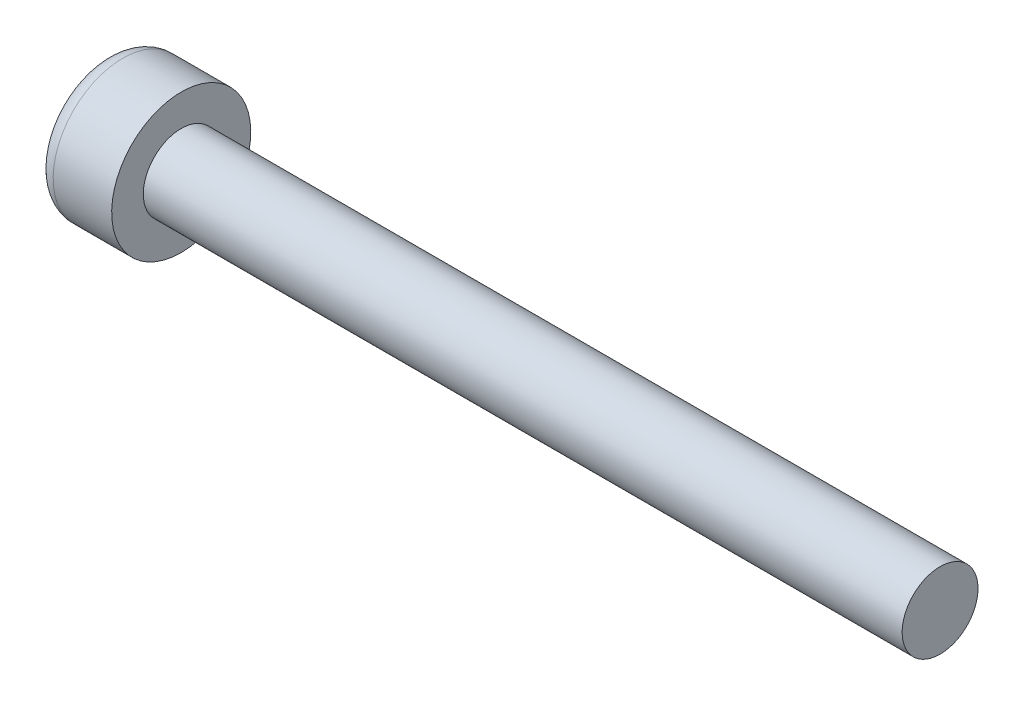
ISO-10303-21;
HEADER;
FILE_DESCRIPTION(('STEP AP214'),'2;1');
FILE_NAME('part.step','',(''),(''),'','','');
FILE_SCHEMA(('AUTOMOTIVE_DESIGN { 1 0 10303 214 1 1 1 1 }'));
ENDSEC;
DATA;
#1=APPLICATION_CONTEXT('core data for automotive mechanical design processes');
#2=APPLICATION_PROTOCOL_DEFINITION('international standard','automotive_design',2000,#1);
#3=PRODUCT_CONTEXT('',#1,'mechanical');
#4=PRODUCT('Part','Part','',(#3));
#5=PRODUCT_RELATED_PRODUCT_CATEGORY('part','',(#4));
#6=PRODUCT_DEFINITION_FORMATION('','',#4);
#7=PRODUCT_DEFINITION_CONTEXT('part definition',#1,'design');
#8=PRODUCT_DEFINITION('design','',#6,#7);
#9=PRODUCT_DEFINITION_SHAPE('','',#8);
#10=(LENGTH_UNIT() NAMED_UNIT(*) SI_UNIT(.MILLI.,.METRE.));
#11=(NAMED_UNIT(*) PLANE_ANGLE_UNIT() SI_UNIT($,.RADIAN.));
#12=(NAMED_UNIT(*) SI_UNIT($,.STERADIAN.) SOLID_ANGLE_UNIT());
#13=UNCERTAINTY_MEASURE_WITH_UNIT(LENGTH_MEASURE(1.E-05),#10,'distance_accuracy_value','');
#14=(GEOMETRIC_REPRESENTATION_CONTEXT(3) GLOBAL_UNCERTAINTY_ASSIGNED_CONTEXT((#13)) GLOBAL_UNIT_ASSIGNED_CONTEXT((#10,
#11,#12)) REPRESENTATION_CONTEXT('',''));
#15=CARTESIAN_POINT('',(0.,0.,0.));
#16=DIRECTION('',(0.,0.,1.));
#17=DIRECTION('',(1.,0.,0.));
#18=AXIS2_PLACEMENT_3D('',#15,#16,#17);
#19=CARTESIAN_POINT('',(0.,0.,0.));
#20=DIRECTION('',(1.,0.,0.));
#21=DIRECTION('',(0.,1.,0.));
#22=AXIS2_PLACEMENT_3D('',#19,#20,#21);
#23=PLANE('',#22);
#24=DIRECTION('',(0.,-0.5,-0.866025403784438));
#25=VECTOR('',#24,1.);
#26=CARTESIAN_POINT('',(0.,1.44337567297406,0.));
#27=LINE('',#26,#25);
#28=CARTESIAN_POINT('',(0.,1.44337567297406,0.));
#29=VERTEX_POINT('',#28);
#30=CARTESIAN_POINT('',(0.,0.721687836487031,-1.25));
#31=VERTEX_POINT('',#30);
#32=EDGE_CURVE('E121',#29,#31,#27,.T.);
#33=ORIENTED_EDGE('',*,*,#32,.F.);
#34=DIRECTION('',(0.,0.5,-0.866025403784439));
#35=VECTOR('',#34,1.);
#36=CARTESIAN_POINT('',(0.,0.721687836487032,1.25));
#37=LINE('',#36,#35);
#38=CARTESIAN_POINT('',(0.,0.721687836487032,1.25));
#39=VERTEX_POINT('',#38);
#40=EDGE_CURVE('E47',#39,#29,#37,.T.);
#41=ORIENTED_EDGE('',*,*,#40,.F.);
#42=DIRECTION('',(0.,1.,0.));
#43=VECTOR('',#42,1.);
#44=CARTESIAN_POINT('',(0.,-0.721687836487031,1.25));
#45=LINE('',#44,#43);
#46=CARTESIAN_POINT('',(0.,-0.721687836487031,1.25));
#47=VERTEX_POINT('',#46);
#48=EDGE_CURVE('E130',#47,#39,#45,.T.);
#49=ORIENTED_EDGE('',*,*,#48,.F.);
#50=DIRECTION('',(0.,0.5,0.866025403784439));
#51=VECTOR('',#50,1.);
#52=CARTESIAN_POINT('',(0.,-1.44337567297406,0.));
#53=LINE('',#52,#51);
#54=CARTESIAN_POINT('',(0.,-1.44337567297406,0.));
#55=VERTEX_POINT('',#54);
#56=EDGE_CURVE('E128',#55,#47,#53,.T.);
#57=ORIENTED_EDGE('',*,*,#56,.F.);
#58=DIRECTION('',(0.,-0.5,0.866025403784438));
#59=VECTOR('',#58,1.);
#60=CARTESIAN_POINT('',(0.,-0.721687836487032,-1.25));
#61=LINE('',#60,#59);
#62=CARTESIAN_POINT('',(0.,-0.721687836487032,-1.25));
#63=VERTEX_POINT('',#62);
#64=EDGE_CURVE('E95',#63,#55,#61,.T.);
#65=ORIENTED_EDGE('',*,*,#64,.F.);
#66=DIRECTION('',(0.,-1.,0.));
#67=VECTOR('',#66,1.);
#68=CARTESIAN_POINT('',(0.,0.721687836487031,-1.25));
#69=LINE('',#68,#67);
#70=EDGE_CURVE('E124',#31,#63,#69,.T.);
#71=ORIENTED_EDGE('',*,*,#70,.F.);
#72=EDGE_LOOP('',(#33,#41,#49,#57,#65,#71));
#73=FACE_BOUND('',#72,.T.);
#74=CARTESIAN_POINT('',(0.,0.,0.));
#75=DIRECTION('',(-1.,0.,0.));
#76=DIRECTION('',(0.,-1.,0.));
#77=AXIS2_PLACEMENT_3D('',#74,#75,#76);
#78=CIRCLE('',#77,2.0625);
#79=CARTESIAN_POINT('',(0.,-2.0625,0.));
#80=VERTEX_POINT('',#79);
#81=EDGE_CURVE('E11',#80,#80,#78,.T.);
#82=ORIENTED_EDGE('',*,*,#81,.T.);
#83=EDGE_LOOP('',(#82));
#84=FACE_BOUND('',#83,.T.);
#85=ADVANCED_FACE('F33',(#73,#84),#23,.F.);
#86=CARTESIAN_POINT('',(0.6875,0.,0.));
#87=DIRECTION('',(-1.,0.,0.));
#88=DIRECTION('',(0.,-1.,0.));
#89=AXIS2_PLACEMENT_3D('',#86,#87,#88);
#90=TOROIDAL_SURFACE('',#89,2.0625,0.6875);
#91=ORIENTED_EDGE('',*,*,#81,.F.);
#92=EDGE_LOOP('',(#91));
#93=FACE_BOUND('',#92,.T.);
#94=CARTESIAN_POINT('',(0.6875,0.,0.));
#95=DIRECTION('',(-1.,0.,0.));
#96=DIRECTION('',(0.,-1.,0.));
#97=AXIS2_PLACEMENT_3D('',#94,#95,#96);
#98=CIRCLE('',#97,2.75);
#99=CARTESIAN_POINT('',(0.687500000000001,-2.75,0.));
#100=VERTEX_POINT('',#99);
#101=EDGE_CURVE('E40',#100,#100,#98,.T.);
#102=ORIENTED_EDGE('',*,*,#101,.T.);
#103=EDGE_LOOP('',(#102));
#104=FACE_BOUND('',#103,.T.);
#105=ADVANCED_FACE('F150',(#93,#104),#90,.T.);
#106=CARTESIAN_POINT('',(0.,0.,0.));
#107=DIRECTION('',(-1.,0.,0.));
#108=DIRECTION('',(0.,-1.,0.));
#109=AXIS2_PLACEMENT_3D('',#106,#107,#108);
#110=CYLINDRICAL_SURFACE('',#109,2.75);
#111=ORIENTED_EDGE('',*,*,#101,.F.);
#112=EDGE_LOOP('',(#111));
#113=FACE_BOUND('',#112,.T.);
#114=CARTESIAN_POINT('',(3.,0.,0.));
#115=DIRECTION('',(-1.,0.,0.));
#116=DIRECTION('',(0.,-1.,0.));
#117=AXIS2_PLACEMENT_3D('',#114,#115,#116);
#118=CIRCLE('',#117,2.75);
#119=CARTESIAN_POINT('',(3.,-2.75,0.));
#120=VERTEX_POINT('',#119);
#121=EDGE_CURVE('E145',#120,#120,#118,.T.);
#122=ORIENTED_EDGE('',*,*,#121,.T.);
#123=EDGE_LOOP('',(#122));
#124=FACE_BOUND('',#123,.T.);
#125=ADVANCED_FACE('F152',(#113,#124),#110,.T.);
#126=CARTESIAN_POINT('',(3.,2.75,0.));
#127=DIRECTION('',(-1.,0.,0.));
#128=DIRECTION('',(0.,-1.,0.));
#129=AXIS2_PLACEMENT_3D('',#126,#127,#128);
#130=PLANE('',#129);
#131=ORIENTED_EDGE('',*,*,#121,.F.);
#132=EDGE_LOOP('',(#131));
#133=FACE_BOUND('',#132,.T.);
#134=CARTESIAN_POINT('',(3.,0.,0.));
#135=DIRECTION('',(-1.,0.,0.));
#136=DIRECTION('',(0.,-1.,0.));
#137=AXIS2_PLACEMENT_3D('',#134,#135,#136);
#138=CIRCLE('',#137,1.5);
#139=CARTESIAN_POINT('',(3.,-1.5,0.));
#140=VERTEX_POINT('',#139);
#141=EDGE_CURVE('E142',#140,#140,#138,.T.);
#142=ORIENTED_EDGE('',*,*,#141,.T.);
#143=EDGE_LOOP('',(#142));
#144=FACE_BOUND('',#143,.T.);
#145=ADVANCED_FACE('F155',(#133,#144),#130,.F.);
#146=CARTESIAN_POINT('',(0.,0.,0.));
#147=DIRECTION('',(-1.,0.,0.));
#148=DIRECTION('',(0.,-1.,0.));
#149=AXIS2_PLACEMENT_3D('',#146,#147,#148);
#150=CYLINDRICAL_SURFACE('',#149,1.5);
#151=ORIENTED_EDGE('',*,*,#141,.F.);
#152=EDGE_LOOP('',(#151));
#153=FACE_BOUND('',#152,.T.);
#154=CARTESIAN_POINT('',(33.,0.,0.));
#155=DIRECTION('',(-1.,0.,0.));
#156=DIRECTION('',(0.,-1.,0.));
#157=AXIS2_PLACEMENT_3D('',#154,#155,#156);
#158=CIRCLE('',#157,1.49999999999999);
#159=CARTESIAN_POINT('',(33.,-1.49999999999999,0.));
#160=VERTEX_POINT('',#159);
#161=EDGE_CURVE('E134',#160,#160,#158,.T.);
#162=ORIENTED_EDGE('',*,*,#161,.T.);
#163=EDGE_LOOP('',(#162));
#164=FACE_BOUND('',#163,.T.);
#165=ADVANCED_FACE('F161',(#153,#164),#150,.T.);
#166=CARTESIAN_POINT('',(33.,1.5,0.));
#167=DIRECTION('',(-1.,0.,0.));
#168=DIRECTION('',(0.,-1.,0.));
#169=AXIS2_PLACEMENT_3D('',#166,#167,#168);
#170=PLANE('',#169);
#171=ORIENTED_EDGE('',*,*,#161,.F.);
#172=EDGE_LOOP('',(#171));
#173=FACE_BOUND('',#172,.T.);
#174=ADVANCED_FACE('F167',(#173),#170,.F.);
#175=CARTESIAN_POINT('',(1.5,0.721687836487032,1.25));
#176=DIRECTION('',(0.,0.866025403784438,0.5));
#177=DIRECTION('',(0.,-0.5,0.866025403784439));
#178=AXIS2_PLACEMENT_3D('',#175,#176,#177);
#179=PLANE('',#178);
#180=ORIENTED_EDGE('',*,*,#40,.T.);
#181=DIRECTION('',(-1.,0.,0.));
#182=VECTOR('',#181,1.);
#183=CARTESIAN_POINT('',(1.5,1.44337567297406,0.));
#184=LINE('',#183,#182);
#185=CARTESIAN_POINT('',(1.5,1.44337567297406,0.));
#186=VERTEX_POINT('',#185);
#187=EDGE_CURVE('E77',#186,#29,#184,.T.);
#188=ORIENTED_EDGE('',*,*,#187,.F.);
#189=DIRECTION('',(0.,0.5,-0.866025403784439));
#190=VECTOR('',#189,1.);
#191=CARTESIAN_POINT('',(1.5,0.721687836487032,1.25));
#192=LINE('',#191,#190);
#193=CARTESIAN_POINT('',(1.5,0.721687836487032,1.25));
#194=VERTEX_POINT('',#193);
#195=EDGE_CURVE('E132',#194,#186,#192,.T.);
#196=ORIENTED_EDGE('',*,*,#195,.F.);
#197=DIRECTION('',(-1.,0.,0.));
#198=VECTOR('',#197,1.);
#199=CARTESIAN_POINT('',(1.5,0.721687836487032,1.25));
#200=LINE('',#199,#198);
#201=EDGE_CURVE('E55',#194,#39,#200,.T.);
#202=ORIENTED_EDGE('',*,*,#201,.T.);
#203=EDGE_LOOP('',(#180,#188,#196,#202));
#204=FACE_BOUND('',#203,.T.);
#205=ADVANCED_FACE('F172',(#204),#179,.F.);
#206=CARTESIAN_POINT('',(1.5,-0.721687836487031,1.25));
#207=DIRECTION('',(0.,0.,1.));
#208=DIRECTION('',(1.,0.,0.));
#209=AXIS2_PLACEMENT_3D('',#206,#207,#208);
#210=PLANE('',#209);
#211=ORIENTED_EDGE('',*,*,#48,.T.);
#212=ORIENTED_EDGE('',*,*,#201,.F.);
#213=DIRECTION('',(0.,1.,0.));
#214=VECTOR('',#213,1.);
#215=CARTESIAN_POINT('',(1.5,-0.721687836487031,1.25));
#216=LINE('',#215,#214);
#217=CARTESIAN_POINT('',(1.5,-0.721687836487031,1.25));
#218=VERTEX_POINT('',#217);
#219=EDGE_CURVE('E107',#218,#194,#216,.T.);
#220=ORIENTED_EDGE('',*,*,#219,.F.);
#221=DIRECTION('',(-1.,0.,0.));
#222=VECTOR('',#221,1.);
#223=CARTESIAN_POINT('',(1.5,-0.721687836487031,1.25));
#224=LINE('',#223,#222);
#225=EDGE_CURVE('E99',#218,#47,#224,.T.);
#226=ORIENTED_EDGE('',*,*,#225,.T.);
#227=EDGE_LOOP('',(#211,#212,#220,#226));
#228=FACE_BOUND('',#227,.T.);
#229=ADVANCED_FACE('F177',(#228),#210,.F.);
#230=CARTESIAN_POINT('',(1.5,-1.44337567297406,0.));
#231=DIRECTION('',(0.,-0.866025403784439,0.5));
#232=DIRECTION('',(0.,-0.5,-0.866025403784439));
#233=AXIS2_PLACEMENT_3D('',#230,#231,#232);
#234=PLANE('',#233);
#235=ORIENTED_EDGE('',*,*,#56,.T.);
#236=ORIENTED_EDGE('',*,*,#225,.F.);
#237=DIRECTION('',(0.,0.5,0.866025403784439));
#238=VECTOR('',#237,1.);
#239=CARTESIAN_POINT('',(1.5,-1.44337567297406,0.));
#240=LINE('',#239,#238);
#241=CARTESIAN_POINT('',(1.5,-1.44337567297406,0.));
#242=VERTEX_POINT('',#241);
#243=EDGE_CURVE('E103',#242,#218,#240,.T.);
#244=ORIENTED_EDGE('',*,*,#243,.F.);
#245=DIRECTION('',(-1.,0.,0.));
#246=VECTOR('',#245,1.);
#247=CARTESIAN_POINT('',(1.5,-1.44337567297406,0.));
#248=LINE('',#247,#246);
#249=EDGE_CURVE('E88',#242,#55,#248,.T.);
#250=ORIENTED_EDGE('',*,*,#249,.T.);
#251=EDGE_LOOP('',(#235,#236,#244,#250));
#252=FACE_BOUND('',#251,.T.);
#253=ADVANCED_FACE('F104',(#252),#234,.F.);
#254=CARTESIAN_POINT('',(1.5,-0.721687836487032,-1.25));
#255=DIRECTION('',(0.,-0.866025403784438,-0.5));
#256=DIRECTION('',(0.,0.5,-0.866025403784438));
#257=AXIS2_PLACEMENT_3D('',#254,#255,#256);
#258=PLANE('',#257);
#259=ORIENTED_EDGE('',*,*,#64,.T.);
#260=ORIENTED_EDGE('',*,*,#249,.F.);
#261=DIRECTION('',(0.,-0.5,0.866025403784438));
#262=VECTOR('',#261,1.);
#263=CARTESIAN_POINT('',(1.5,-0.721687836487032,-1.25));
#264=LINE('',#263,#262);
#265=CARTESIAN_POINT('',(1.5,-0.721687836487032,-1.25));
#266=VERTEX_POINT('',#265);
#267=EDGE_CURVE('E92',#266,#242,#264,.T.);
#268=ORIENTED_EDGE('',*,*,#267,.F.);
#269=DIRECTION('',(-1.,0.,0.));
#270=VECTOR('',#269,1.);
#271=CARTESIAN_POINT('',(1.5,-0.721687836487032,-1.25));
#272=LINE('',#271,#270);
#273=EDGE_CURVE('E100',#266,#63,#272,.T.);
#274=ORIENTED_EDGE('',*,*,#273,.T.);
#275=EDGE_LOOP('',(#259,#260,#268,#274));
#276=FACE_BOUND('',#275,.T.);
#277=ADVANCED_FACE('F90',(#276),#258,.F.);
#278=CARTESIAN_POINT('',(1.5,0.721687836487031,-1.25));
#279=DIRECTION('',(0.,0.,-1.));
#280=DIRECTION('',(-1.,0.,0.));
#281=AXIS2_PLACEMENT_3D('',#278,#279,#280);
#282=PLANE('',#281);
#283=ORIENTED_EDGE('',*,*,#70,.T.);
#284=ORIENTED_EDGE('',*,*,#273,.F.);
#285=DIRECTION('',(0.,-1.,0.));
#286=VECTOR('',#285,1.);
#287=CARTESIAN_POINT('',(1.5,0.721687836487031,-1.25));
#288=LINE('',#287,#286);
#289=CARTESIAN_POINT('',(1.5,0.721687836487031,-1.25));
#290=VERTEX_POINT('',#289);
#291=EDGE_CURVE('E113',#290,#266,#288,.T.);
#292=ORIENTED_EDGE('',*,*,#291,.F.);
#293=DIRECTION('',(-1.,0.,0.));
#294=VECTOR('',#293,1.);
#295=CARTESIAN_POINT('',(1.5,0.721687836487031,-1.25));
#296=LINE('',#295,#294);
#297=EDGE_CURVE('E137',#290,#31,#296,.T.);
#298=ORIENTED_EDGE('',*,*,#297,.T.);
#299=EDGE_LOOP('',(#283,#284,#292,#298));
#300=FACE_BOUND('',#299,.T.);
#301=ADVANCED_FACE('F203',(#300),#282,.F.);
#302=CARTESIAN_POINT('',(1.5,1.44337567297406,0.));
#303=DIRECTION('',(0.,0.866025403784438,-0.5));
#304=DIRECTION('',(0.,0.5,0.866025403784439));
#305=AXIS2_PLACEMENT_3D('',#302,#303,#304);
#306=PLANE('',#305);
#307=ORIENTED_EDGE('',*,*,#32,.T.);
#308=ORIENTED_EDGE('',*,*,#297,.F.);
#309=DIRECTION('',(0.,-0.5,-0.866025403784438));
#310=VECTOR('',#309,1.);
#311=CARTESIAN_POINT('',(1.5,1.44337567297406,0.));
#312=LINE('',#311,#310);
#313=EDGE_CURVE('E115',#186,#290,#312,.T.);
#314=ORIENTED_EDGE('',*,*,#313,.F.);
#315=ORIENTED_EDGE('',*,*,#187,.T.);
#316=EDGE_LOOP('',(#307,#308,#314,#315));
#317=FACE_BOUND('',#316,.T.);
#318=ADVANCED_FACE('F191',(#317),#306,.F.);
#319=CARTESIAN_POINT('',(1.5,0.,0.));
#320=DIRECTION('',(-1.,0.,0.));
#321=DIRECTION('',(0.,-1.,0.));
#322=AXIS2_PLACEMENT_3D('',#319,#320,#321);
#323=PLANE('',#322);
#324=ORIENTED_EDGE('',*,*,#195,.T.);
#325=ORIENTED_EDGE('',*,*,#313,.T.);
#326=ORIENTED_EDGE('',*,*,#291,.T.);
#327=ORIENTED_EDGE('',*,*,#267,.T.);
#328=ORIENTED_EDGE('',*,*,#243,.T.);
#329=ORIENTED_EDGE('',*,*,#219,.T.);
#330=EDGE_LOOP('',(#324,#325,#326,#327,#328,#329));
#331=FACE_BOUND('',#330,.T.);
#332=ADVANCED_FACE('F110',(#331),#323,.T.);
#333=CLOSED_SHELL('',(#85,#105,#125,#145,#165,#174,#205,#229,#253,#277,#301,#318,#332));
#334=MANIFOLD_SOLID_BREP('B2',#333);
#335=ADVANCED_BREP_SHAPE_REPRESENTATION('',(#18,#334),#14);
#336=SHAPE_DEFINITION_REPRESENTATION(#9,#335);
ENDSEC;
END-ISO-10303-21;
